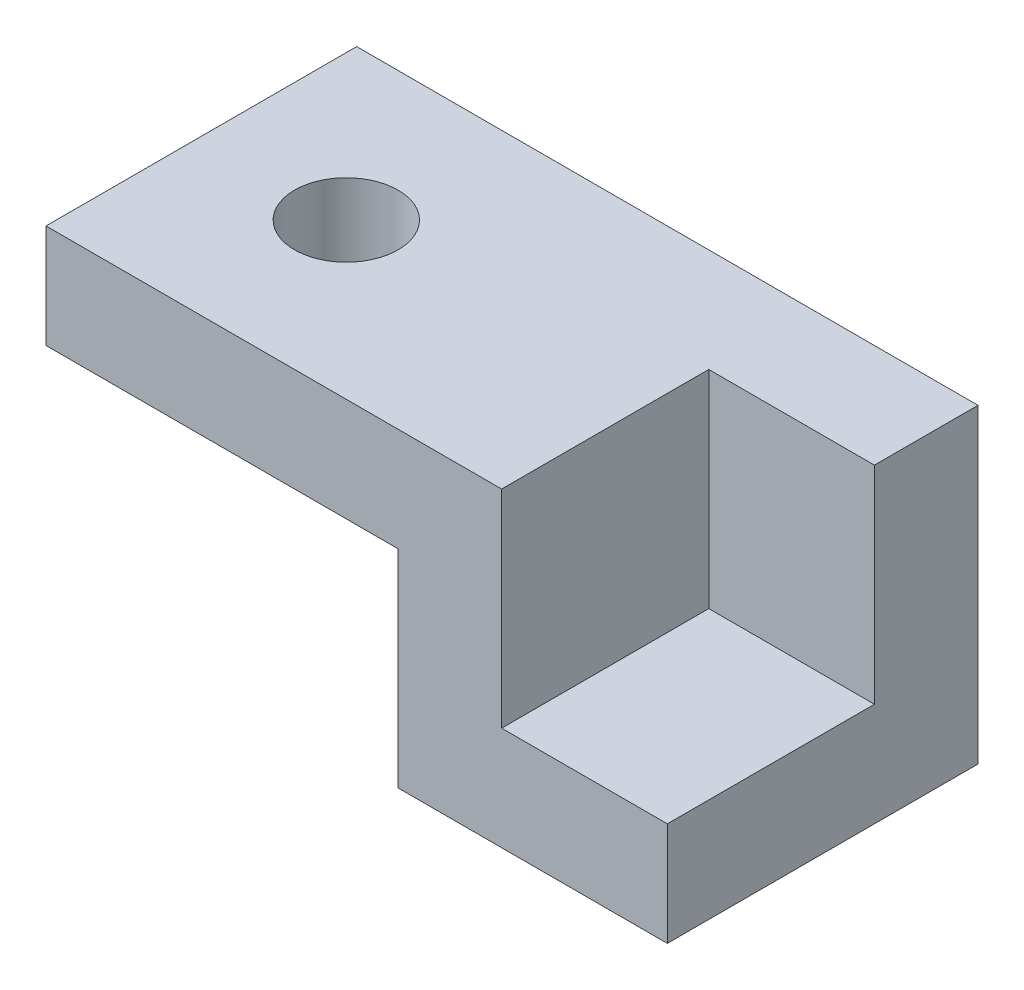
ISO-10303-21;
HEADER;
FILE_DESCRIPTION(('STEP AP214'),'2;1');
FILE_NAME('part.step','',(''),(''),'','','');
FILE_SCHEMA(('AUTOMOTIVE_DESIGN { 1 0 10303 214 1 1 1 1 }'));
ENDSEC;
DATA;
#1=APPLICATION_CONTEXT('core data for automotive mechanical design processes');
#2=APPLICATION_PROTOCOL_DEFINITION('international standard','automotive_design',2000,#1);
#3=PRODUCT_CONTEXT('',#1,'mechanical');
#4=PRODUCT('Part','Part','',(#3));
#5=PRODUCT_RELATED_PRODUCT_CATEGORY('part','',(#4));
#6=PRODUCT_DEFINITION_FORMATION('','',#4);
#7=PRODUCT_DEFINITION_CONTEXT('part definition',#1,'design');
#8=PRODUCT_DEFINITION('design','',#6,#7);
#9=PRODUCT_DEFINITION_SHAPE('','',#8);
#10=(LENGTH_UNIT() NAMED_UNIT(*) SI_UNIT(.MILLI.,.METRE.));
#11=(NAMED_UNIT(*) PLANE_ANGLE_UNIT() SI_UNIT($,.RADIAN.));
#12=(NAMED_UNIT(*) SI_UNIT($,.STERADIAN.) SOLID_ANGLE_UNIT());
#13=UNCERTAINTY_MEASURE_WITH_UNIT(LENGTH_MEASURE(1.E-05),#10,'distance_accuracy_value','');
#14=(GEOMETRIC_REPRESENTATION_CONTEXT(3) GLOBAL_UNCERTAINTY_ASSIGNED_CONTEXT((#13)) GLOBAL_UNIT_ASSIGNED_CONTEXT((#10,
#11,#12)) REPRESENTATION_CONTEXT('',''));
#15=CARTESIAN_POINT('',(0.,0.,0.));
#16=DIRECTION('',(0.,0.,1.));
#17=DIRECTION('',(1.,0.,0.));
#18=AXIS2_PLACEMENT_3D('',#15,#16,#17);
#19=CARTESIAN_POINT('',(0.,75.,75.));
#20=DIRECTION('',(0.,-1.,0.));
#21=DIRECTION('',(1.,0.,0.));
#22=AXIS2_PLACEMENT_3D('',#19,#20,#21);
#23=PLANE('',#22);
#24=CARTESIAN_POINT('',(-115.,75.,37.5));
#25=DIRECTION('',(0.,1.,0.));
#26=DIRECTION('',(-1.,0.,0.));
#27=AXIS2_PLACEMENT_3D('',#24,#25,#26);
#28=CIRCLE('',#27,12.5);
#29=CARTESIAN_POINT('',(-127.5,75.,37.5));
#30=VERTEX_POINT('',#29);
#31=EDGE_CURVE('E195',#30,#30,#28,.T.);
#32=ORIENTED_EDGE('',*,*,#31,.F.);
#33=EDGE_LOOP('',(#32));
#34=FACE_BOUND('',#33,.T.);
#35=DIRECTION('',(-1.,0.,0.));
#36=VECTOR('',#35,1.);
#37=CARTESIAN_POINT('',(0.,75.,25.));
#38=LINE('',#37,#36);
#39=CARTESIAN_POINT('',(0.,75.,25.));
#40=VERTEX_POINT('',#39);
#41=CARTESIAN_POINT('',(-40.,75.,25.));
#42=VERTEX_POINT('',#41);
#43=EDGE_CURVE('E183',#40,#42,#38,.T.);
#44=ORIENTED_EDGE('',*,*,#43,.F.);
#45=DIRECTION('',(0.,0.,-1.));
#46=VECTOR('',#45,1.);
#47=CARTESIAN_POINT('',(0.,75.,75.));
#48=LINE('',#47,#46);
#49=CARTESIAN_POINT('',(0.,75.,0.));
#50=VERTEX_POINT('',#49);
#51=EDGE_CURVE('E11',#40,#50,#48,.T.);
#52=ORIENTED_EDGE('',*,*,#51,.T.);
#53=DIRECTION('',(-1.,0.,0.));
#54=VECTOR('',#53,1.);
#55=CARTESIAN_POINT('',(0.,75.,0.));
#56=LINE('',#55,#54);
#57=CARTESIAN_POINT('',(-150.,75.,0.));
#58=VERTEX_POINT('',#57);
#59=EDGE_CURVE('E140',#50,#58,#56,.T.);
#60=ORIENTED_EDGE('',*,*,#59,.T.);
#61=DIRECTION('',(0.,0.,-1.));
#62=VECTOR('',#61,1.);
#63=CARTESIAN_POINT('',(-150.,75.,75.));
#64=LINE('',#63,#62);
#65=CARTESIAN_POINT('',(-150.,75.,75.));
#66=VERTEX_POINT('',#65);
#67=EDGE_CURVE('E47',#66,#58,#64,.T.);
#68=ORIENTED_EDGE('',*,*,#67,.F.);
#69=DIRECTION('',(-1.,0.,0.));
#70=VECTOR('',#69,1.);
#71=CARTESIAN_POINT('',(0.,75.,75.));
#72=LINE('',#71,#70);
#73=CARTESIAN_POINT('',(-40.,75.,75.));
#74=VERTEX_POINT('',#73);
#75=EDGE_CURVE('E98',#74,#66,#72,.T.);
#76=ORIENTED_EDGE('',*,*,#75,.F.);
#77=DIRECTION('',(0.,0.,1.));
#78=VECTOR('',#77,1.);
#79=CARTESIAN_POINT('',(-40.,75.,25.));
#80=LINE('',#79,#78);
#81=EDGE_CURVE('E169',#42,#74,#80,.T.);
#82=ORIENTED_EDGE('',*,*,#81,.F.);
#83=EDGE_LOOP('',(#44,#52,#60,#68,#76,#82));
#84=FACE_BOUND('',#83,.T.);
#85=ADVANCED_FACE('F41',(#34,#84),#23,.F.);
#86=CARTESIAN_POINT('',(0.,0.,75.));
#87=DIRECTION('',(-1.,0.,0.));
#88=DIRECTION('',(0.,0.,1.));
#89=AXIS2_PLACEMENT_3D('',#86,#87,#88);
#90=PLANE('',#89);
#91=DIRECTION('',(0.,1.,0.));
#92=VECTOR('',#91,1.);
#93=CARTESIAN_POINT('',(0.,75.,25.));
#94=LINE('',#93,#92);
#95=CARTESIAN_POINT('',(0.,25.,25.));
#96=VERTEX_POINT('',#95);
#97=EDGE_CURVE('E180',#96,#40,#94,.T.);
#98=ORIENTED_EDGE('',*,*,#97,.F.);
#99=DIRECTION('',(0.,0.,1.));
#100=VECTOR('',#99,1.);
#101=CARTESIAN_POINT('',(0.,25.,25.));
#102=LINE('',#101,#100);
#103=CARTESIAN_POINT('',(0.,25.,75.));
#104=VERTEX_POINT('',#103);
#105=EDGE_CURVE('E139',#96,#104,#102,.T.);
#106=ORIENTED_EDGE('',*,*,#105,.T.);
#107=DIRECTION('',(0.,1.,0.));
#108=VECTOR('',#107,1.);
#109=CARTESIAN_POINT('',(0.,0.,75.));
#110=LINE('',#109,#108);
#111=CARTESIAN_POINT('',(0.,0.,75.));
#112=VERTEX_POINT('',#111);
#113=EDGE_CURVE('E148',#112,#104,#110,.T.);
#114=ORIENTED_EDGE('',*,*,#113,.F.);
#115=DIRECTION('',(0.,0.,-1.));
#116=VECTOR('',#115,1.);
#117=CARTESIAN_POINT('',(0.,0.,75.));
#118=LINE('',#117,#116);
#119=CARTESIAN_POINT('',(0.,0.,0.));
#120=VERTEX_POINT('',#119);
#121=EDGE_CURVE('E128',#112,#120,#118,.T.);
#122=ORIENTED_EDGE('',*,*,#121,.T.);
#123=DIRECTION('',(0.,1.,0.));
#124=VECTOR('',#123,1.);
#125=CARTESIAN_POINT('',(0.,0.,0.));
#126=LINE('',#125,#124);
#127=EDGE_CURVE('E131',#120,#50,#126,.T.);
#128=ORIENTED_EDGE('',*,*,#127,.T.);
#129=ORIENTED_EDGE('',*,*,#51,.F.);
#130=EDGE_LOOP('',(#98,#106,#114,#122,#128,#129));
#131=FACE_BOUND('',#130,.T.);
#132=ADVANCED_FACE('F43',(#131),#90,.F.);
#133=CARTESIAN_POINT('',(-150.,75.,75.));
#134=DIRECTION('',(1.,0.,0.));
#135=DIRECTION('',(0.,0.,-1.));
#136=AXIS2_PLACEMENT_3D('',#133,#134,#135);
#137=PLANE('',#136);
#138=DIRECTION('',(0.,-1.,0.));
#139=VECTOR('',#138,1.);
#140=CARTESIAN_POINT('',(-150.,75.,0.));
#141=LINE('',#140,#139);
#142=CARTESIAN_POINT('',(-150.,50.,0.));
#143=VERTEX_POINT('',#142);
#144=EDGE_CURVE('E138',#58,#143,#141,.T.);
#145=ORIENTED_EDGE('',*,*,#144,.T.);
#146=DIRECTION('',(0.,0.,-1.));
#147=VECTOR('',#146,1.);
#148=CARTESIAN_POINT('',(-150.,50.,75.));
#149=LINE('',#148,#147);
#150=CARTESIAN_POINT('',(-150.,50.,75.));
#151=VERTEX_POINT('',#150);
#152=EDGE_CURVE('E123',#151,#143,#149,.T.);
#153=ORIENTED_EDGE('',*,*,#152,.F.);
#154=DIRECTION('',(0.,-1.,0.));
#155=VECTOR('',#154,1.);
#156=CARTESIAN_POINT('',(-150.,75.,75.));
#157=LINE('',#156,#155);
#158=EDGE_CURVE('E114',#66,#151,#157,.T.);
#159=ORIENTED_EDGE('',*,*,#158,.F.);
#160=ORIENTED_EDGE('',*,*,#67,.T.);
#161=EDGE_LOOP('',(#145,#153,#159,#160));
#162=FACE_BOUND('',#161,.T.);
#163=ADVANCED_FACE('F155',(#162),#137,.F.);
#164=CARTESIAN_POINT('',(-65.,50.,75.));
#165=DIRECTION('',(0.,1.,0.));
#166=DIRECTION('',(-1.,0.,0.));
#167=AXIS2_PLACEMENT_3D('',#164,#165,#166);
#168=PLANE('',#167);
#169=CARTESIAN_POINT('',(-115.,50.,37.5));
#170=DIRECTION('',(0.,1.,0.));
#171=DIRECTION('',(-1.,0.,0.));
#172=AXIS2_PLACEMENT_3D('',#169,#170,#171);
#173=CIRCLE('',#172,12.5);
#174=CARTESIAN_POINT('',(-127.5,50.,37.5));
#175=VERTEX_POINT('',#174);
#176=EDGE_CURVE('E176',#175,#175,#173,.F.);
#177=ORIENTED_EDGE('',*,*,#176,.F.);
#178=EDGE_LOOP('',(#177));
#179=FACE_BOUND('',#178,.T.);
#180=DIRECTION('',(1.,0.,0.));
#181=VECTOR('',#180,1.);
#182=CARTESIAN_POINT('',(-65.,50.,0.));
#183=LINE('',#182,#181);
#184=CARTESIAN_POINT('',(-65.,50.,0.));
#185=VERTEX_POINT('',#184);
#186=EDGE_CURVE('E125',#143,#185,#183,.T.);
#187=ORIENTED_EDGE('',*,*,#186,.T.);
#188=DIRECTION('',(0.,0.,-1.));
#189=VECTOR('',#188,1.);
#190=CARTESIAN_POINT('',(-65.,50.,75.));
#191=LINE('',#190,#189);
#192=CARTESIAN_POINT('',(-65.,50.,75.));
#193=VERTEX_POINT('',#192);
#194=EDGE_CURVE('E116',#193,#185,#191,.T.);
#195=ORIENTED_EDGE('',*,*,#194,.F.);
#196=DIRECTION('',(1.,0.,0.));
#197=VECTOR('',#196,1.);
#198=CARTESIAN_POINT('',(-65.,50.,75.));
#199=LINE('',#198,#197);
#200=EDGE_CURVE('E106',#151,#193,#199,.T.);
#201=ORIENTED_EDGE('',*,*,#200,.F.);
#202=ORIENTED_EDGE('',*,*,#152,.T.);
#203=EDGE_LOOP('',(#187,#195,#201,#202));
#204=FACE_BOUND('',#203,.T.);
#205=ADVANCED_FACE('F118',(#179,#204),#168,.F.);
#206=CARTESIAN_POINT('',(-65.,0.,75.));
#207=DIRECTION('',(1.,0.,0.));
#208=DIRECTION('',(0.,0.,-1.));
#209=AXIS2_PLACEMENT_3D('',#206,#207,#208);
#210=PLANE('',#209);
#211=DIRECTION('',(0.,-1.,0.));
#212=VECTOR('',#211,1.);
#213=CARTESIAN_POINT('',(-65.,0.,0.));
#214=LINE('',#213,#212);
#215=CARTESIAN_POINT('',(-65.,0.,0.));
#216=VERTEX_POINT('',#215);
#217=EDGE_CURVE('E141',#185,#216,#214,.T.);
#218=ORIENTED_EDGE('',*,*,#217,.T.);
#219=DIRECTION('',(0.,0.,-1.));
#220=VECTOR('',#219,1.);
#221=CARTESIAN_POINT('',(-65.,0.,75.));
#222=LINE('',#221,#220);
#223=CARTESIAN_POINT('',(-65.,0.,75.));
#224=VERTEX_POINT('',#223);
#225=EDGE_CURVE('E127',#224,#216,#222,.T.);
#226=ORIENTED_EDGE('',*,*,#225,.F.);
#227=DIRECTION('',(0.,-1.,0.));
#228=VECTOR('',#227,1.);
#229=CARTESIAN_POINT('',(-65.,0.,75.));
#230=LINE('',#229,#228);
#231=EDGE_CURVE('E109',#193,#224,#230,.T.);
#232=ORIENTED_EDGE('',*,*,#231,.F.);
#233=ORIENTED_EDGE('',*,*,#194,.T.);
#234=EDGE_LOOP('',(#218,#226,#232,#233));
#235=FACE_BOUND('',#234,.T.);
#236=ADVANCED_FACE('F126',(#235),#210,.F.);
#237=CARTESIAN_POINT('',(0.,0.,75.));
#238=DIRECTION('',(0.,1.,0.));
#239=DIRECTION('',(0.,0.,1.));
#240=AXIS2_PLACEMENT_3D('',#237,#238,#239);
#241=PLANE('',#240);
#242=DIRECTION('',(1.,0.,0.));
#243=VECTOR('',#242,1.);
#244=CARTESIAN_POINT('',(0.,0.,0.));
#245=LINE('',#244,#243);
#246=EDGE_CURVE('E93',#216,#120,#245,.T.);
#247=ORIENTED_EDGE('',*,*,#246,.T.);
#248=ORIENTED_EDGE('',*,*,#121,.F.);
#249=DIRECTION('',(1.,0.,0.));
#250=VECTOR('',#249,1.);
#251=CARTESIAN_POINT('',(0.,0.,75.));
#252=LINE('',#251,#250);
#253=EDGE_CURVE('E63',#224,#112,#252,.T.);
#254=ORIENTED_EDGE('',*,*,#253,.F.);
#255=ORIENTED_EDGE('',*,*,#225,.T.);
#256=EDGE_LOOP('',(#247,#248,#254,#255));
#257=FACE_BOUND('',#256,.T.);
#258=ADVANCED_FACE('F158',(#257),#241,.F.);
#259=CARTESIAN_POINT('',(0.,0.,75.));
#260=DIRECTION('',(0.,0.,1.));
#261=DIRECTION('',(1.,0.,0.));
#262=AXIS2_PLACEMENT_3D('',#259,#260,#261);
#263=PLANE('',#262);
#264=DIRECTION('',(0.,-1.,0.));
#265=VECTOR('',#264,1.);
#266=CARTESIAN_POINT('',(-40.,75.,75.));
#267=LINE('',#266,#265);
#268=CARTESIAN_POINT('',(-40.,25.,75.));
#269=VERTEX_POINT('',#268);
#270=EDGE_CURVE('E57',#74,#269,#267,.T.);
#271=ORIENTED_EDGE('',*,*,#270,.F.);
#272=ORIENTED_EDGE('',*,*,#75,.T.);
#273=ORIENTED_EDGE('',*,*,#158,.T.);
#274=ORIENTED_EDGE('',*,*,#200,.T.);
#275=ORIENTED_EDGE('',*,*,#231,.T.);
#276=ORIENTED_EDGE('',*,*,#253,.T.);
#277=ORIENTED_EDGE('',*,*,#113,.T.);
#278=DIRECTION('',(1.,0.,0.));
#279=VECTOR('',#278,1.);
#280=CARTESIAN_POINT('',(0.,25.,75.));
#281=LINE('',#280,#279);
#282=EDGE_CURVE('E171',#269,#104,#281,.T.);
#283=ORIENTED_EDGE('',*,*,#282,.F.);
#284=EDGE_LOOP('',(#271,#272,#273,#274,#275,#276,#277,#283));
#285=FACE_BOUND('',#284,.T.);
#286=ADVANCED_FACE('F107',(#285),#263,.T.);
#287=CARTESIAN_POINT('',(0.,0.,0.));
#288=DIRECTION('',(0.,0.,1.));
#289=DIRECTION('',(1.,0.,0.));
#290=AXIS2_PLACEMENT_3D('',#287,#288,#289);
#291=PLANE('',#290);
#292=ORIENTED_EDGE('',*,*,#127,.F.);
#293=ORIENTED_EDGE('',*,*,#246,.F.);
#294=ORIENTED_EDGE('',*,*,#217,.F.);
#295=ORIENTED_EDGE('',*,*,#186,.F.);
#296=ORIENTED_EDGE('',*,*,#144,.F.);
#297=ORIENTED_EDGE('',*,*,#59,.F.);
#298=EDGE_LOOP('',(#292,#293,#294,#295,#296,#297));
#299=FACE_BOUND('',#298,.T.);
#300=ADVANCED_FACE('F160',(#299),#291,.F.);
#301=CARTESIAN_POINT('',(0.,25.,25.));
#302=DIRECTION('',(0.,-1.,0.));
#303=DIRECTION('',(1.,0.,0.));
#304=AXIS2_PLACEMENT_3D('',#301,#302,#303);
#305=PLANE('',#304);
#306=ORIENTED_EDGE('',*,*,#282,.T.);
#307=ORIENTED_EDGE('',*,*,#105,.F.);
#308=DIRECTION('',(1.,0.,0.));
#309=VECTOR('',#308,1.);
#310=CARTESIAN_POINT('',(0.,25.,25.));
#311=LINE('',#310,#309);
#312=CARTESIAN_POINT('',(-40.,25.,25.));
#313=VERTEX_POINT('',#312);
#314=EDGE_CURVE('E172',#313,#96,#311,.T.);
#315=ORIENTED_EDGE('',*,*,#314,.F.);
#316=DIRECTION('',(0.,0.,1.));
#317=VECTOR('',#316,1.);
#318=CARTESIAN_POINT('',(-40.,25.,25.));
#319=LINE('',#318,#317);
#320=EDGE_CURVE('E168',#313,#269,#319,.T.);
#321=ORIENTED_EDGE('',*,*,#320,.T.);
#322=EDGE_LOOP('',(#306,#307,#315,#321));
#323=FACE_BOUND('',#322,.T.);
#324=ADVANCED_FACE('F215',(#323),#305,.F.);
#325=CARTESIAN_POINT('',(-40.,75.,25.));
#326=DIRECTION('',(-1.,0.,0.));
#327=DIRECTION('',(0.,0.,1.));
#328=AXIS2_PLACEMENT_3D('',#325,#326,#327);
#329=PLANE('',#328);
#330=ORIENTED_EDGE('',*,*,#270,.T.);
#331=ORIENTED_EDGE('',*,*,#320,.F.);
#332=DIRECTION('',(0.,-1.,0.));
#333=VECTOR('',#332,1.);
#334=CARTESIAN_POINT('',(-40.,75.,25.));
#335=LINE('',#334,#333);
#336=EDGE_CURVE('E185',#42,#313,#335,.T.);
#337=ORIENTED_EDGE('',*,*,#336,.F.);
#338=ORIENTED_EDGE('',*,*,#81,.T.);
#339=EDGE_LOOP('',(#330,#331,#337,#338));
#340=FACE_BOUND('',#339,.T.);
#341=ADVANCED_FACE('F216',(#340),#329,.F.);
#342=CARTESIAN_POINT('',(0.,0.,25.));
#343=DIRECTION('',(0.,0.,-1.));
#344=DIRECTION('',(-1.,0.,0.));
#345=AXIS2_PLACEMENT_3D('',#342,#343,#344);
#346=PLANE('',#345);
#347=ORIENTED_EDGE('',*,*,#97,.T.);
#348=ORIENTED_EDGE('',*,*,#43,.T.);
#349=ORIENTED_EDGE('',*,*,#336,.T.);
#350=ORIENTED_EDGE('',*,*,#314,.T.);
#351=EDGE_LOOP('',(#347,#348,#349,#350));
#352=FACE_BOUND('',#351,.T.);
#353=ADVANCED_FACE('F208',(#352),#346,.F.);
#354=CARTESIAN_POINT('',(-115.,14.6446609406726,37.5));
#355=DIRECTION('',(0.,1.,0.));
#356=DIRECTION('',(-1.,0.,0.));
#357=AXIS2_PLACEMENT_3D('',#354,#355,#356);
#358=CYLINDRICAL_SURFACE('',#357,12.5);
#359=ORIENTED_EDGE('',*,*,#176,.T.);
#360=EDGE_LOOP('',(#359));
#361=FACE_BOUND('',#360,.T.);
#362=ORIENTED_EDGE('',*,*,#31,.T.);
#363=EDGE_LOOP('',(#362));
#364=FACE_BOUND('',#363,.T.);
#365=ADVANCED_FACE('F198',(#361,#364),#358,.F.);
#366=CLOSED_SHELL('',(#85,#132,#163,#205,#236,#258,#286,#300,#324,#341,#353,#365));
#367=MANIFOLD_SOLID_BREP('B2',#366);
#368=ADVANCED_BREP_SHAPE_REPRESENTATION('',(#18,#367),#14);
#369=SHAPE_DEFINITION_REPRESENTATION(#9,#368);
ENDSEC;
END-ISO-10303-21;
